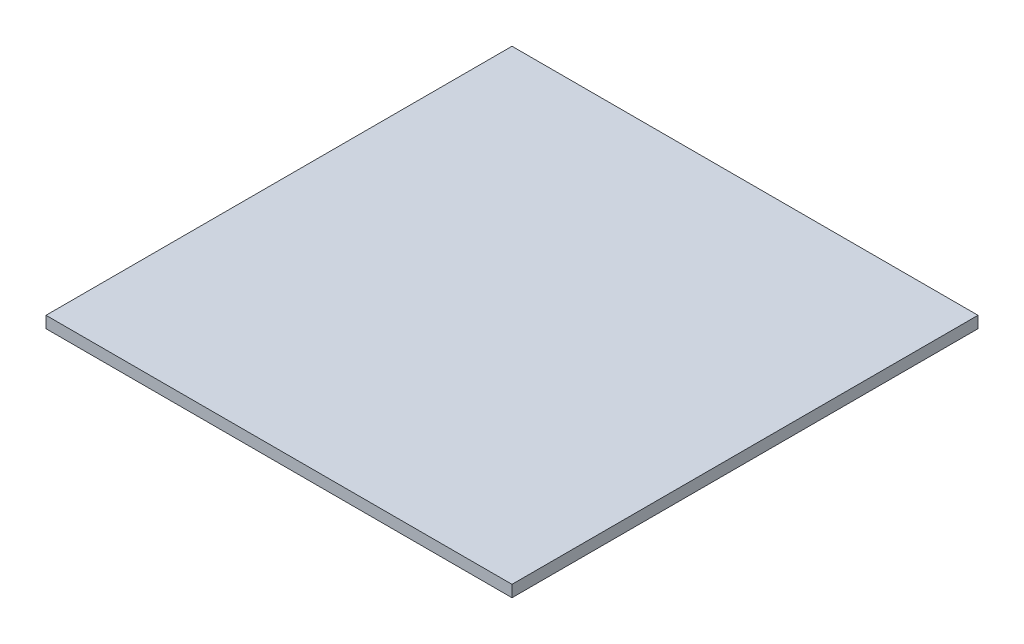
ISO-10303-21;
HEADER;
FILE_DESCRIPTION(('STEP AP214'),'2;1');
FILE_NAME('part.step','',(''),(''),'','','');
FILE_SCHEMA(('AUTOMOTIVE_DESIGN { 1 0 10303 214 1 1 1 1 }'));
ENDSEC;
DATA;
#1=APPLICATION_CONTEXT('core data for automotive mechanical design processes');
#2=APPLICATION_PROTOCOL_DEFINITION('international standard','automotive_design',2000,#1);
#3=PRODUCT_CONTEXT('',#1,'mechanical');
#4=PRODUCT('Part','Part','',(#3));
#5=PRODUCT_RELATED_PRODUCT_CATEGORY('part','',(#4));
#6=PRODUCT_DEFINITION_FORMATION('','',#4);
#7=PRODUCT_DEFINITION_CONTEXT('part definition',#1,'design');
#8=PRODUCT_DEFINITION('design','',#6,#7);
#9=PRODUCT_DEFINITION_SHAPE('','',#8);
#10=(LENGTH_UNIT() NAMED_UNIT(*) SI_UNIT(.MILLI.,.METRE.));
#11=(NAMED_UNIT(*) PLANE_ANGLE_UNIT() SI_UNIT($,.RADIAN.));
#12=(NAMED_UNIT(*) SI_UNIT($,.STERADIAN.) SOLID_ANGLE_UNIT());
#13=UNCERTAINTY_MEASURE_WITH_UNIT(LENGTH_MEASURE(1.E-05),#10,'distance_accuracy_value','');
#14=(GEOMETRIC_REPRESENTATION_CONTEXT(3) GLOBAL_UNCERTAINTY_ASSIGNED_CONTEXT((#13)) GLOBAL_UNIT_ASSIGNED_CONTEXT((#10,
#11,#12)) REPRESENTATION_CONTEXT('',''));
#15=CARTESIAN_POINT('',(0.,0.,0.));
#16=DIRECTION('',(0.,0.,1.));
#17=DIRECTION('',(1.,0.,0.));
#18=AXIS2_PLACEMENT_3D('',#15,#16,#17);
#19=CARTESIAN_POINT('',(0.,-2.5,0.));
#20=DIRECTION('',(0.,1.,0.));
#21=DIRECTION('',(0.,0.,1.));
#22=AXIS2_PLACEMENT_3D('',#19,#20,#21);
#23=PLANE('',#22);
#24=DIRECTION('',(0.,0.,-1.));
#25=VECTOR('',#24,1.);
#26=CARTESIAN_POINT('',(100.,-2.5,-100.));
#27=LINE('',#26,#25);
#28=CARTESIAN_POINT('',(100.,-2.5,100.));
#29=VERTEX_POINT('',#28);
#30=CARTESIAN_POINT('',(100.,-2.5,-100.));
#31=VERTEX_POINT('',#30);
#32=EDGE_CURVE('E205',#29,#31,#27,.T.);
#33=ORIENTED_EDGE('',*,*,#32,.F.);
#34=DIRECTION('',(1.,0.,0.));
#35=VECTOR('',#34,1.);
#36=CARTESIAN_POINT('',(-100.,-2.5,100.));
#37=LINE('',#36,#35);
#38=CARTESIAN_POINT('',(-100.,-2.5,100.));
#39=VERTEX_POINT('',#38);
#40=EDGE_CURVE('E214',#39,#29,#37,.T.);
#41=ORIENTED_EDGE('',*,*,#40,.F.);
#42=DIRECTION('',(0.,0.,1.));
#43=VECTOR('',#42,1.);
#44=CARTESIAN_POINT('',(-100.,-2.5,-100.));
#45=LINE('',#44,#43);
#46=CARTESIAN_POINT('',(-100.,-2.5,-100.));
#47=VERTEX_POINT('',#46);
#48=EDGE_CURVE('E211',#47,#39,#45,.T.);
#49=ORIENTED_EDGE('',*,*,#48,.F.);
#50=DIRECTION('',(-1.,0.,0.));
#51=VECTOR('',#50,1.);
#52=CARTESIAN_POINT('',(-100.,-2.5,-100.));
#53=LINE('',#52,#51);
#54=EDGE_CURVE('E208',#31,#47,#53,.T.);
#55=ORIENTED_EDGE('',*,*,#54,.F.);
#56=EDGE_LOOP('',(#33,#41,#49,#55));
#57=FACE_BOUND('',#56,.T.);
#58=DIRECTION('',(0.,0.,-1.));
#59=VECTOR('',#58,1.);
#60=CARTESIAN_POINT('',(-44.9999999999999,-2.5,47.5));
#61=LINE('',#60,#59);
#62=CARTESIAN_POINT('',(-44.9999999999999,-2.5,47.5));
#63=VERTEX_POINT('',#62);
#64=CARTESIAN_POINT('',(-44.9999999999999,-2.5,-47.5));
#65=VERTEX_POINT('',#64);
#66=EDGE_CURVE('E142',#63,#65,#61,.T.);
#67=ORIENTED_EDGE('',*,*,#66,.F.);
#68=DIRECTION('',(-1.,0.,0.));
#69=VECTOR('',#68,1.);
#70=CARTESIAN_POINT('',(-44.9999999999999,-2.5,47.5));
#71=LINE('',#70,#69);
#72=CARTESIAN_POINT('',(44.9999999999999,-2.5,47.5));
#73=VERTEX_POINT('',#72);
#74=EDGE_CURVE('E170',#73,#63,#71,.T.);
#75=ORIENTED_EDGE('',*,*,#74,.F.);
#76=DIRECTION('',(0.,0.,1.));
#77=VECTOR('',#76,1.);
#78=CARTESIAN_POINT('',(44.9999999999999,-2.5,47.5));
#79=LINE('',#78,#77);
#80=CARTESIAN_POINT('',(44.9999999999999,-2.5,-47.5));
#81=VERTEX_POINT('',#80);
#82=EDGE_CURVE('E57',#81,#73,#79,.T.);
#83=ORIENTED_EDGE('',*,*,#82,.F.);
#84=DIRECTION('',(1.,0.,0.));
#85=VECTOR('',#84,1.);
#86=CARTESIAN_POINT('',(-44.9999999999999,-2.5,-47.5));
#87=LINE('',#86,#85);
#88=EDGE_CURVE('E52',#65,#81,#87,.T.);
#89=ORIENTED_EDGE('',*,*,#88,.F.);
#90=EDGE_LOOP('',(#67,#75,#83,#89));
#91=FACE_BOUND('',#90,.T.);
#92=ADVANCED_FACE('F35',(#57,#91),#23,.F.);
#93=CARTESIAN_POINT('',(100.,-2.5,-100.));
#94=DIRECTION('',(1.,0.,0.));
#95=DIRECTION('',(0.,0.,-1.));
#96=AXIS2_PLACEMENT_3D('',#93,#94,#95);
#97=PLANE('',#96);
#98=DIRECTION('',(0.,1.,0.));
#99=VECTOR('',#98,1.);
#100=CARTESIAN_POINT('',(100.,-2.5,-100.));
#101=LINE('',#100,#99);
#102=CARTESIAN_POINT('',(100.,2.5,-100.));
#103=VERTEX_POINT('',#102);
#104=EDGE_CURVE('E39',#31,#103,#101,.T.);
#105=ORIENTED_EDGE('',*,*,#104,.T.);
#106=DIRECTION('',(0.,0.,-1.));
#107=VECTOR('',#106,1.);
#108=CARTESIAN_POINT('',(100.,2.5,-100.));
#109=LINE('',#108,#107);
#110=CARTESIAN_POINT('',(100.,2.5,100.));
#111=VERTEX_POINT('',#110);
#112=EDGE_CURVE('E193',#111,#103,#109,.T.);
#113=ORIENTED_EDGE('',*,*,#112,.F.);
#114=DIRECTION('',(0.,1.,0.));
#115=VECTOR('',#114,1.);
#116=CARTESIAN_POINT('',(100.,-2.5,100.));
#117=LINE('',#116,#115);
#118=EDGE_CURVE('E11',#29,#111,#117,.T.);
#119=ORIENTED_EDGE('',*,*,#118,.F.);
#120=ORIENTED_EDGE('',*,*,#32,.T.);
#121=EDGE_LOOP('',(#105,#113,#119,#120));
#122=FACE_BOUND('',#121,.T.);
#123=ADVANCED_FACE('F37',(#122),#97,.T.);
#124=CARTESIAN_POINT('',(-100.,-2.5,100.));
#125=DIRECTION('',(0.,0.,1.));
#126=DIRECTION('',(1.,0.,0.));
#127=AXIS2_PLACEMENT_3D('',#124,#125,#126);
#128=PLANE('',#127);
#129=ORIENTED_EDGE('',*,*,#118,.T.);
#130=DIRECTION('',(1.,0.,0.));
#131=VECTOR('',#130,1.);
#132=CARTESIAN_POINT('',(-100.,2.5,100.));
#133=LINE('',#132,#131);
#134=CARTESIAN_POINT('',(-100.,2.5,100.));
#135=VERTEX_POINT('',#134);
#136=EDGE_CURVE('E202',#135,#111,#133,.T.);
#137=ORIENTED_EDGE('',*,*,#136,.F.);
#138=DIRECTION('',(0.,1.,0.));
#139=VECTOR('',#138,1.);
#140=CARTESIAN_POINT('',(-100.,-2.5,100.));
#141=LINE('',#140,#139);
#142=EDGE_CURVE('E44',#39,#135,#141,.T.);
#143=ORIENTED_EDGE('',*,*,#142,.F.);
#144=ORIENTED_EDGE('',*,*,#40,.T.);
#145=EDGE_LOOP('',(#129,#137,#143,#144));
#146=FACE_BOUND('',#145,.T.);
#147=ADVANCED_FACE('F230',(#146),#128,.T.);
#148=CARTESIAN_POINT('',(-100.,-2.5,-100.));
#149=DIRECTION('',(-1.,0.,0.));
#150=DIRECTION('',(0.,0.,1.));
#151=AXIS2_PLACEMENT_3D('',#148,#149,#150);
#152=PLANE('',#151);
#153=ORIENTED_EDGE('',*,*,#142,.T.);
#154=DIRECTION('',(0.,0.,1.));
#155=VECTOR('',#154,1.);
#156=CARTESIAN_POINT('',(-100.,2.5,-100.));
#157=LINE('',#156,#155);
#158=CARTESIAN_POINT('',(-100.,2.5,-100.));
#159=VERTEX_POINT('',#158);
#160=EDGE_CURVE('E199',#159,#135,#157,.T.);
#161=ORIENTED_EDGE('',*,*,#160,.F.);
#162=DIRECTION('',(0.,1.,0.));
#163=VECTOR('',#162,1.);
#164=CARTESIAN_POINT('',(-100.,-2.5,-100.));
#165=LINE('',#164,#163);
#166=EDGE_CURVE('E217',#47,#159,#165,.T.);
#167=ORIENTED_EDGE('',*,*,#166,.F.);
#168=ORIENTED_EDGE('',*,*,#48,.T.);
#169=EDGE_LOOP('',(#153,#161,#167,#168));
#170=FACE_BOUND('',#169,.T.);
#171=ADVANCED_FACE('F235',(#170),#152,.T.);
#172=CARTESIAN_POINT('',(-100.,-2.5,-100.));
#173=DIRECTION('',(0.,0.,-1.));
#174=DIRECTION('',(-1.,0.,0.));
#175=AXIS2_PLACEMENT_3D('',#172,#173,#174);
#176=PLANE('',#175);
#177=ORIENTED_EDGE('',*,*,#166,.T.);
#178=DIRECTION('',(-1.,0.,0.));
#179=VECTOR('',#178,1.);
#180=CARTESIAN_POINT('',(-100.,2.5,-100.));
#181=LINE('',#180,#179);
#182=EDGE_CURVE('E196',#103,#159,#181,.T.);
#183=ORIENTED_EDGE('',*,*,#182,.F.);
#184=ORIENTED_EDGE('',*,*,#104,.F.);
#185=ORIENTED_EDGE('',*,*,#54,.T.);
#186=EDGE_LOOP('',(#177,#183,#184,#185));
#187=FACE_BOUND('',#186,.T.);
#188=ADVANCED_FACE('F224',(#187),#176,.T.);
#189=CARTESIAN_POINT('',(0.,2.5,0.));
#190=DIRECTION('',(0.,1.,0.));
#191=DIRECTION('',(0.,0.,1.));
#192=AXIS2_PLACEMENT_3D('',#189,#190,#191);
#193=PLANE('',#192);
#194=ORIENTED_EDGE('',*,*,#112,.T.);
#195=ORIENTED_EDGE('',*,*,#182,.T.);
#196=ORIENTED_EDGE('',*,*,#160,.T.);
#197=ORIENTED_EDGE('',*,*,#136,.T.);
#198=EDGE_LOOP('',(#194,#195,#196,#197));
#199=FACE_BOUND('',#198,.T.);
#200=ADVANCED_FACE('F227',(#199),#193,.T.);
#201=CARTESIAN_POINT('',(0.,-27.5,0.));
#202=DIRECTION('',(0.,-1.,0.));
#203=DIRECTION('',(0.,0.,-1.));
#204=AXIS2_PLACEMENT_3D('',#201,#202,#203);
#205=PLANE('',#204);
#206=DIRECTION('',(0.,0.,-1.));
#207=VECTOR('',#206,1.);
#208=CARTESIAN_POINT('',(-44.9999999999999,-27.5,47.5));
#209=LINE('',#208,#207);
#210=CARTESIAN_POINT('',(-44.9999999999999,-27.5,47.5));
#211=VERTEX_POINT('',#210);
#212=CARTESIAN_POINT('',(-44.9999999999999,-27.5,-47.5));
#213=VERTEX_POINT('',#212);
#214=EDGE_CURVE('E166',#211,#213,#209,.T.);
#215=ORIENTED_EDGE('',*,*,#214,.T.);
#216=DIRECTION('',(1.,0.,0.));
#217=VECTOR('',#216,1.);
#218=CARTESIAN_POINT('',(-44.9999999999999,-27.5,-47.5));
#219=LINE('',#218,#217);
#220=CARTESIAN_POINT('',(44.9999999999999,-27.5,-47.5));
#221=VERTEX_POINT('',#220);
#222=EDGE_CURVE('E169',#213,#221,#219,.T.);
#223=ORIENTED_EDGE('',*,*,#222,.T.);
#224=DIRECTION('',(0.,0.,1.));
#225=VECTOR('',#224,1.);
#226=CARTESIAN_POINT('',(44.9999999999999,-27.5,47.5));
#227=LINE('',#226,#225);
#228=CARTESIAN_POINT('',(44.9999999999999,-27.5,47.5));
#229=VERTEX_POINT('',#228);
#230=EDGE_CURVE('E172',#221,#229,#227,.T.);
#231=ORIENTED_EDGE('',*,*,#230,.T.);
#232=DIRECTION('',(-1.,0.,0.));
#233=VECTOR('',#232,1.);
#234=CARTESIAN_POINT('',(-44.9999999999999,-27.5,47.5));
#235=LINE('',#234,#233);
#236=EDGE_CURVE('E174',#229,#211,#235,.T.);
#237=ORIENTED_EDGE('',*,*,#236,.T.);
#238=EDGE_LOOP('',(#215,#223,#231,#237));
#239=FACE_BOUND('',#238,.T.);
#240=DIRECTION('',(-1.,0.,0.));
#241=VECTOR('',#240,1.);
#242=CARTESIAN_POINT('',(-42.5,-27.5,37.5));
#243=LINE('',#242,#241);
#244=CARTESIAN_POINT('',(42.4999999999999,-27.5,37.5));
#245=VERTEX_POINT('',#244);
#246=CARTESIAN_POINT('',(-42.5,-27.5,37.5));
#247=VERTEX_POINT('',#246);
#248=EDGE_CURVE('E134',#245,#247,#243,.T.);
#249=ORIENTED_EDGE('',*,*,#248,.F.);
#250=DIRECTION('',(0.,0.,1.));
#251=VECTOR('',#250,1.);
#252=CARTESIAN_POINT('',(42.4999999999999,-27.5,37.5));
#253=LINE('',#252,#251);
#254=CARTESIAN_POINT('',(42.4999999999999,-27.5,-37.5));
#255=VERTEX_POINT('',#254);
#256=EDGE_CURVE('E124',#255,#245,#253,.T.);
#257=ORIENTED_EDGE('',*,*,#256,.F.);
#258=DIRECTION('',(1.,0.,0.));
#259=VECTOR('',#258,1.);
#260=CARTESIAN_POINT('',(-42.4999999999999,-27.5,-37.5));
#261=LINE('',#260,#259);
#262=CARTESIAN_POINT('',(-42.4999999999999,-27.5,-37.5));
#263=VERTEX_POINT('',#262);
#264=EDGE_CURVE('E150',#263,#255,#261,.T.);
#265=ORIENTED_EDGE('',*,*,#264,.F.);
#266=DIRECTION('',(0.,0.,-1.));
#267=VECTOR('',#266,1.);
#268=CARTESIAN_POINT('',(-42.5,-27.5,37.5));
#269=LINE('',#268,#267);
#270=EDGE_CURVE('E148',#247,#263,#269,.T.);
#271=ORIENTED_EDGE('',*,*,#270,.F.);
#272=EDGE_LOOP('',(#249,#257,#265,#271));
#273=FACE_BOUND('',#272,.T.);
#274=ADVANCED_FACE('F146',(#239,#273),#205,.T.);
#275=CARTESIAN_POINT('',(-44.9999999999999,-27.5,47.5));
#276=DIRECTION('',(1.,0.,0.));
#277=DIRECTION('',(0.,0.,-1.));
#278=AXIS2_PLACEMENT_3D('',#275,#276,#277);
#279=PLANE('',#278);
#280=ORIENTED_EDGE('',*,*,#66,.T.);
#281=DIRECTION('',(0.,1.,0.));
#282=VECTOR('',#281,1.);
#283=CARTESIAN_POINT('',(-44.9999999999999,-27.5,-47.5));
#284=LINE('',#283,#282);
#285=EDGE_CURVE('E191',#213,#65,#284,.T.);
#286=ORIENTED_EDGE('',*,*,#285,.F.);
#287=ORIENTED_EDGE('',*,*,#214,.F.);
#288=DIRECTION('',(0.,1.,0.));
#289=VECTOR('',#288,1.);
#290=CARTESIAN_POINT('',(-44.9999999999999,-27.5,47.5));
#291=LINE('',#290,#289);
#292=EDGE_CURVE('E176',#211,#63,#291,.T.);
#293=ORIENTED_EDGE('',*,*,#292,.T.);
#294=EDGE_LOOP('',(#280,#286,#287,#293));
#295=FACE_BOUND('',#294,.T.);
#296=ADVANCED_FACE('F274',(#295),#279,.F.);
#297=CARTESIAN_POINT('',(-44.9999999999999,-27.5,-47.5));
#298=DIRECTION('',(0.,0.,1.));
#299=DIRECTION('',(1.,0.,0.));
#300=AXIS2_PLACEMENT_3D('',#297,#298,#299);
#301=PLANE('',#300);
#302=ORIENTED_EDGE('',*,*,#88,.T.);
#303=DIRECTION('',(0.,1.,0.));
#304=VECTOR('',#303,1.);
#305=CARTESIAN_POINT('',(44.9999999999999,-27.5,-47.5));
#306=LINE('',#305,#304);
#307=EDGE_CURVE('E188',#221,#81,#306,.T.);
#308=ORIENTED_EDGE('',*,*,#307,.F.);
#309=ORIENTED_EDGE('',*,*,#222,.F.);
#310=ORIENTED_EDGE('',*,*,#285,.T.);
#311=EDGE_LOOP('',(#302,#308,#309,#310));
#312=FACE_BOUND('',#311,.T.);
#313=ADVANCED_FACE('F282',(#312),#301,.F.);
#314=CARTESIAN_POINT('',(44.9999999999999,-27.5,47.5));
#315=DIRECTION('',(-1.,0.,0.));
#316=DIRECTION('',(0.,0.,1.));
#317=AXIS2_PLACEMENT_3D('',#314,#315,#316);
#318=PLANE('',#317);
#319=ORIENTED_EDGE('',*,*,#82,.T.);
#320=DIRECTION('',(0.,1.,0.));
#321=VECTOR('',#320,1.);
#322=CARTESIAN_POINT('',(44.9999999999999,-27.5,47.5));
#323=LINE('',#322,#321);
#324=EDGE_CURVE('E185',#229,#73,#323,.T.);
#325=ORIENTED_EDGE('',*,*,#324,.F.);
#326=ORIENTED_EDGE('',*,*,#230,.F.);
#327=ORIENTED_EDGE('',*,*,#307,.T.);
#328=EDGE_LOOP('',(#319,#325,#326,#327));
#329=FACE_BOUND('',#328,.T.);
#330=ADVANCED_FACE('F278',(#329),#318,.F.);
#331=CARTESIAN_POINT('',(-44.9999999999999,-27.5,47.5));
#332=DIRECTION('',(0.,0.,-1.));
#333=DIRECTION('',(-1.,0.,0.));
#334=AXIS2_PLACEMENT_3D('',#331,#332,#333);
#335=PLANE('',#334);
#336=ORIENTED_EDGE('',*,*,#74,.T.);
#337=ORIENTED_EDGE('',*,*,#292,.F.);
#338=ORIENTED_EDGE('',*,*,#236,.F.);
#339=ORIENTED_EDGE('',*,*,#324,.T.);
#340=EDGE_LOOP('',(#336,#337,#338,#339));
#341=FACE_BOUND('',#340,.T.);
#342=ADVANCED_FACE('F271',(#341),#335,.F.);
#343=CARTESIAN_POINT('',(42.4999999999999,-27.5,37.5));
#344=DIRECTION('',(-1.,0.,0.));
#345=DIRECTION('',(0.,0.,1.));
#346=AXIS2_PLACEMENT_3D('',#343,#344,#345);
#347=PLANE('',#346);
#348=DIRECTION('',(0.,0.,1.));
#349=VECTOR('',#348,1.);
#350=CARTESIAN_POINT('',(42.4999999999999,-2.5,37.5));
#351=LINE('',#350,#349);
#352=CARTESIAN_POINT('',(42.4999999999999,-2.5,-37.5));
#353=VERTEX_POINT('',#352);
#354=CARTESIAN_POINT('',(42.4999999999999,-2.5,37.5));
#355=VERTEX_POINT('',#354);
#356=EDGE_CURVE('E154',#353,#355,#351,.T.);
#357=ORIENTED_EDGE('',*,*,#356,.F.);
#358=DIRECTION('',(0.,1.,0.));
#359=VECTOR('',#358,1.);
#360=CARTESIAN_POINT('',(42.4999999999999,-27.5,-37.5));
#361=LINE('',#360,#359);
#362=EDGE_CURVE('E130',#255,#353,#361,.T.);
#363=ORIENTED_EDGE('',*,*,#362,.F.);
#364=ORIENTED_EDGE('',*,*,#256,.T.);
#365=DIRECTION('',(0.,1.,0.));
#366=VECTOR('',#365,1.);
#367=CARTESIAN_POINT('',(42.4999999999999,-27.5,37.5));
#368=LINE('',#367,#366);
#369=EDGE_CURVE('E128',#245,#355,#368,.T.);
#370=ORIENTED_EDGE('',*,*,#369,.T.);
#371=EDGE_LOOP('',(#357,#363,#364,#370));
#372=FACE_BOUND('',#371,.T.);
#373=ADVANCED_FACE('F127',(#372),#347,.T.);
#374=CARTESIAN_POINT('',(-42.5,-27.5,37.5));
#375=DIRECTION('',(0.,0.,-1.));
#376=DIRECTION('',(-1.,0.,0.));
#377=AXIS2_PLACEMENT_3D('',#374,#375,#376);
#378=PLANE('',#377);
#379=DIRECTION('',(-1.,0.,0.));
#380=VECTOR('',#379,1.);
#381=CARTESIAN_POINT('',(-42.5,-2.5,37.5));
#382=LINE('',#381,#380);
#383=CARTESIAN_POINT('',(-42.5,-2.5,37.5));
#384=VERTEX_POINT('',#383);
#385=EDGE_CURVE('E141',#355,#384,#382,.T.);
#386=ORIENTED_EDGE('',*,*,#385,.F.);
#387=ORIENTED_EDGE('',*,*,#369,.F.);
#388=ORIENTED_EDGE('',*,*,#248,.T.);
#389=DIRECTION('',(0.,1.,0.));
#390=VECTOR('',#389,1.);
#391=CARTESIAN_POINT('',(-42.5,-27.5,37.5));
#392=LINE('',#391,#390);
#393=EDGE_CURVE('E143',#247,#384,#392,.T.);
#394=ORIENTED_EDGE('',*,*,#393,.T.);
#395=EDGE_LOOP('',(#386,#387,#388,#394));
#396=FACE_BOUND('',#395,.T.);
#397=ADVANCED_FACE('F138',(#396),#378,.T.);
#398=CARTESIAN_POINT('',(-42.5,-27.5,37.5));
#399=DIRECTION('',(1.,0.,0.));
#400=DIRECTION('',(0.,0.,-1.));
#401=AXIS2_PLACEMENT_3D('',#398,#399,#400);
#402=PLANE('',#401);
#403=DIRECTION('',(0.,0.,-1.));
#404=VECTOR('',#403,1.);
#405=CARTESIAN_POINT('',(-42.5,-2.5,37.5));
#406=LINE('',#405,#404);
#407=CARTESIAN_POINT('',(-42.4999999999999,-2.5,-37.5));
#408=VERTEX_POINT('',#407);
#409=EDGE_CURVE('E157',#384,#408,#406,.T.);
#410=ORIENTED_EDGE('',*,*,#409,.F.);
#411=ORIENTED_EDGE('',*,*,#393,.F.);
#412=ORIENTED_EDGE('',*,*,#270,.T.);
#413=DIRECTION('',(0.,1.,0.));
#414=VECTOR('',#413,1.);
#415=CARTESIAN_POINT('',(-42.4999999999999,-27.5,-37.5));
#416=LINE('',#415,#414);
#417=EDGE_CURVE('E163',#263,#408,#416,.T.);
#418=ORIENTED_EDGE('',*,*,#417,.T.);
#419=EDGE_LOOP('',(#410,#411,#412,#418));
#420=FACE_BOUND('',#419,.T.);
#421=ADVANCED_FACE('F256',(#420),#402,.T.);
#422=CARTESIAN_POINT('',(-42.4999999999999,-27.5,-37.5));
#423=DIRECTION('',(0.,0.,1.));
#424=DIRECTION('',(1.,0.,0.));
#425=AXIS2_PLACEMENT_3D('',#422,#423,#424);
#426=PLANE('',#425);
#427=DIRECTION('',(1.,0.,0.));
#428=VECTOR('',#427,1.);
#429=CARTESIAN_POINT('',(-42.4999999999999,-2.5,-37.5));
#430=LINE('',#429,#428);
#431=EDGE_CURVE('E135',#408,#353,#430,.T.);
#432=ORIENTED_EDGE('',*,*,#431,.F.);
#433=ORIENTED_EDGE('',*,*,#417,.F.);
#434=ORIENTED_EDGE('',*,*,#264,.T.);
#435=ORIENTED_EDGE('',*,*,#362,.T.);
#436=EDGE_LOOP('',(#432,#433,#434,#435));
#437=FACE_BOUND('',#436,.T.);
#438=ADVANCED_FACE('F251',(#437),#426,.T.);
#439=ORIENTED_EDGE('',*,*,#431,.T.);
#440=ORIENTED_EDGE('',*,*,#356,.T.);
#441=ORIENTED_EDGE('',*,*,#385,.T.);
#442=ORIENTED_EDGE('',*,*,#409,.T.);
#443=EDGE_LOOP('',(#439,#440,#441,#442));
#444=FACE_BOUND('',#443,.T.);
#445=ADVANCED_FACE('F245',(#444),#23,.F.);
#446=CLOSED_SHELL('',(#92,#123,#147,#171,#188,#200,#274,#296,#313,#330,#342,#373,#397,#421,#438,#445));
#447=MANIFOLD_SOLID_BREP('B2',#446);
#448=ADVANCED_BREP_SHAPE_REPRESENTATION('',(#18,#447),#14);
#449=SHAPE_DEFINITION_REPRESENTATION(#9,#448);
ENDSEC;
END-ISO-10303-21;
